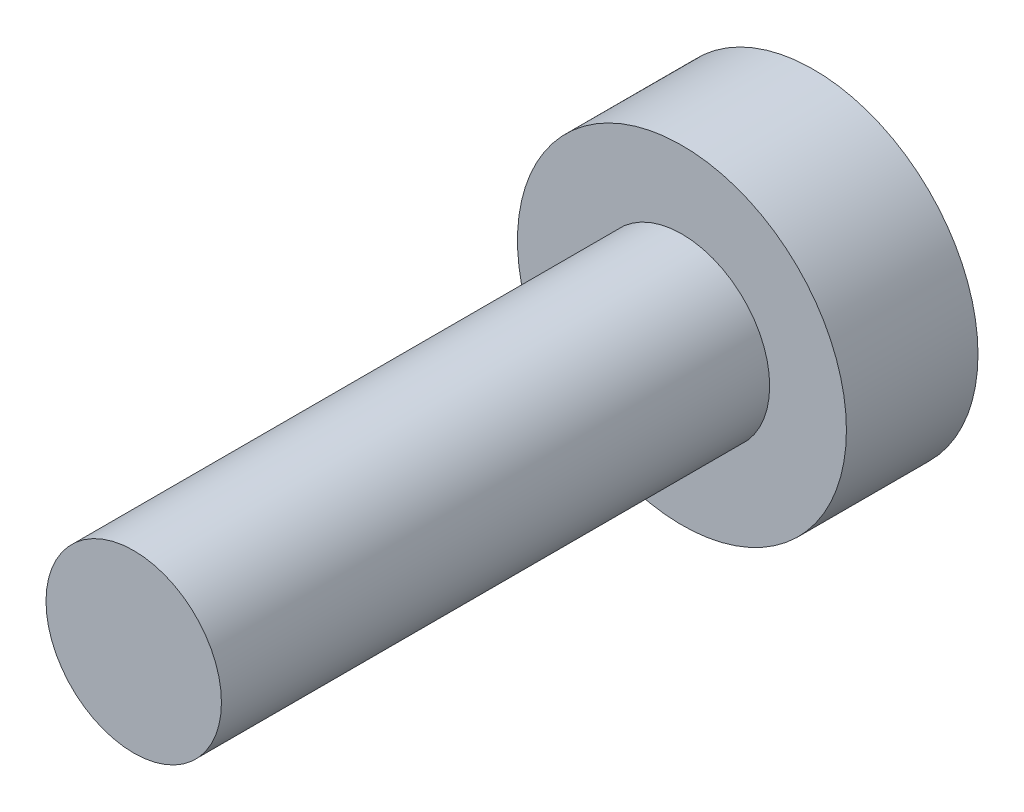
ISO-10303-21;
HEADER;
FILE_DESCRIPTION(('STEP AP214'),'2;1');
FILE_NAME('part.step','',(''),(''),'','','');
FILE_SCHEMA(('AUTOMOTIVE_DESIGN { 1 0 10303 214 1 1 1 1 }'));
ENDSEC;
DATA;
#1=APPLICATION_CONTEXT('core data for automotive mechanical design processes');
#2=APPLICATION_PROTOCOL_DEFINITION('international standard','automotive_design',2000,#1);
#3=PRODUCT_CONTEXT('',#1,'mechanical');
#4=PRODUCT('Part','Part','',(#3));
#5=PRODUCT_RELATED_PRODUCT_CATEGORY('part','',(#4));
#6=PRODUCT_DEFINITION_FORMATION('','',#4);
#7=PRODUCT_DEFINITION_CONTEXT('part definition',#1,'design');
#8=PRODUCT_DEFINITION('design','',#6,#7);
#9=PRODUCT_DEFINITION_SHAPE('','',#8);
#10=(LENGTH_UNIT() NAMED_UNIT(*) SI_UNIT(.MILLI.,.METRE.));
#11=(NAMED_UNIT(*) PLANE_ANGLE_UNIT() SI_UNIT($,.RADIAN.));
#12=(NAMED_UNIT(*) SI_UNIT($,.STERADIAN.) SOLID_ANGLE_UNIT());
#13=UNCERTAINTY_MEASURE_WITH_UNIT(LENGTH_MEASURE(1.E-05),#10,'distance_accuracy_value','');
#14=(GEOMETRIC_REPRESENTATION_CONTEXT(3) GLOBAL_UNCERTAINTY_ASSIGNED_CONTEXT((#13)) GLOBAL_UNIT_ASSIGNED_CONTEXT((#10,
#11,#12)) REPRESENTATION_CONTEXT('',''));
#15=CARTESIAN_POINT('',(0.,0.,0.));
#16=DIRECTION('',(0.,0.,1.));
#17=DIRECTION('',(1.,0.,0.));
#18=AXIS2_PLACEMENT_3D('',#15,#16,#17);
#19=CARTESIAN_POINT('',(0.,0.,5.));
#20=DIRECTION('',(0.,0.,-1.));
#21=DIRECTION('',(-1.,0.,0.));
#22=AXIS2_PLACEMENT_3D('',#19,#20,#21);
#23=CYLINDRICAL_SURFACE('',#22,0.8);
#24=CARTESIAN_POINT('',(0.,0.,5.));
#25=DIRECTION('',(0.,0.,1.));
#26=DIRECTION('',(1.,0.,0.));
#27=AXIS2_PLACEMENT_3D('',#24,#25,#26);
#28=CIRCLE('',#27,0.8);
#29=CARTESIAN_POINT('',(0.8,0.,5.));
#30=VERTEX_POINT('',#29);
#31=EDGE_CURVE('E10',#30,#30,#28,.T.);
#32=ORIENTED_EDGE('',*,*,#31,.F.);
#33=EDGE_LOOP('',(#32));
#34=FACE_BOUND('',#33,.T.);
#35=CARTESIAN_POINT('',(0.,0.,0.));
#36=DIRECTION('',(0.,0.,1.));
#37=DIRECTION('',(1.,0.,0.));
#38=AXIS2_PLACEMENT_3D('',#35,#36,#37);
#39=CIRCLE('',#38,0.8);
#40=CARTESIAN_POINT('',(0.8,0.,0.));
#41=VERTEX_POINT('',#40);
#42=EDGE_CURVE('E44',#41,#41,#39,.T.);
#43=ORIENTED_EDGE('',*,*,#42,.T.);
#44=EDGE_LOOP('',(#43));
#45=FACE_BOUND('',#44,.T.);
#46=ADVANCED_FACE('F41',(#34,#45),#23,.T.);
#47=CARTESIAN_POINT('',(0.,0.,5.));
#48=DIRECTION('',(0.,0.,1.));
#49=DIRECTION('',(1.,0.,0.));
#50=AXIS2_PLACEMENT_3D('',#47,#48,#49);
#51=PLANE('',#50);
#52=ORIENTED_EDGE('',*,*,#31,.T.);
#53=EDGE_LOOP('',(#52));
#54=FACE_BOUND('',#53,.T.);
#55=ADVANCED_FACE('F72',(#54),#51,.T.);
#56=CARTESIAN_POINT('',(0.,0.,-1.2));
#57=DIRECTION('',(0.,0.,1.));
#58=DIRECTION('',(1.,0.,0.));
#59=AXIS2_PLACEMENT_3D('',#56,#57,#58);
#60=CYLINDRICAL_SURFACE('',#59,1.5);
#61=CARTESIAN_POINT('',(0.,0.,-1.2));
#62=DIRECTION('',(0.,0.,1.));
#63=DIRECTION('',(1.,0.,0.));
#64=AXIS2_PLACEMENT_3D('',#61,#62,#63);
#65=CIRCLE('',#64,1.5);
#66=CARTESIAN_POINT('',(1.5,0.,-1.2));
#67=VERTEX_POINT('',#66);
#68=EDGE_CURVE('E51',#67,#67,#65,.T.);
#69=ORIENTED_EDGE('',*,*,#68,.T.);
#70=EDGE_LOOP('',(#69));
#71=FACE_BOUND('',#70,.T.);
#72=CARTESIAN_POINT('',(0.,0.,0.));
#73=DIRECTION('',(0.,0.,1.));
#74=DIRECTION('',(1.,0.,0.));
#75=AXIS2_PLACEMENT_3D('',#72,#73,#74);
#76=CIRCLE('',#75,1.5);
#77=CARTESIAN_POINT('',(1.5,0.,0.));
#78=VERTEX_POINT('',#77);
#79=EDGE_CURVE('E53',#78,#78,#76,.T.);
#80=ORIENTED_EDGE('',*,*,#79,.F.);
#81=EDGE_LOOP('',(#80));
#82=FACE_BOUND('',#81,.T.);
#83=ADVANCED_FACE('F59',(#71,#82),#60,.T.);
#84=CARTESIAN_POINT('',(0.,0.,-1.2));
#85=DIRECTION('',(0.,0.,1.));
#86=DIRECTION('',(1.,0.,0.));
#87=AXIS2_PLACEMENT_3D('',#84,#85,#86);
#88=PLANE('',#87);
#89=ORIENTED_EDGE('',*,*,#68,.F.);
#90=EDGE_LOOP('',(#89));
#91=FACE_BOUND('',#90,.T.);
#92=ADVANCED_FACE('F62',(#91),#88,.F.);
#93=CARTESIAN_POINT('',(0.,0.,0.));
#94=DIRECTION('',(0.,0.,1.));
#95=DIRECTION('',(1.,0.,0.));
#96=AXIS2_PLACEMENT_3D('',#93,#94,#95);
#97=PLANE('',#96);
#98=ORIENTED_EDGE('',*,*,#42,.F.);
#99=EDGE_LOOP('',(#98));
#100=FACE_BOUND('',#99,.T.);
#101=ORIENTED_EDGE('',*,*,#79,.T.);
#102=EDGE_LOOP('',(#101));
#103=FACE_BOUND('',#102,.T.);
#104=ADVANCED_FACE('F64',(#100,#103),#97,.T.);
#105=CLOSED_SHELL('',(#46,#55,#83,#92,#104));
#106=MANIFOLD_SOLID_BREP('B2',#105);
#107=ADVANCED_BREP_SHAPE_REPRESENTATION('',(#18,#106),#14);
#108=SHAPE_DEFINITION_REPRESENTATION(#9,#107);
ENDSEC;
END-ISO-10303-21;
